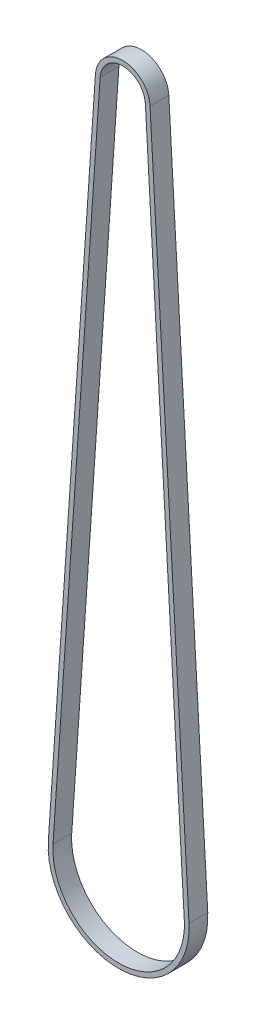
ISO-10303-21;
HEADER;
FILE_DESCRIPTION(('STEP AP214'),'2;1');
FILE_NAME('part.step','',(''),(''),'','','');
FILE_SCHEMA(('AUTOMOTIVE_DESIGN { 1 0 10303 214 1 1 1 1 }'));
ENDSEC;
DATA;
#1=APPLICATION_CONTEXT('core data for automotive mechanical design processes');
#2=APPLICATION_PROTOCOL_DEFINITION('international standard','automotive_design',2000,#1);
#3=PRODUCT_CONTEXT('',#1,'mechanical');
#4=PRODUCT('Part','Part','',(#3));
#5=PRODUCT_RELATED_PRODUCT_CATEGORY('part','',(#4));
#6=PRODUCT_DEFINITION_FORMATION('','',#4);
#7=PRODUCT_DEFINITION_CONTEXT('part definition',#1,'design');
#8=PRODUCT_DEFINITION('design','',#6,#7);
#9=PRODUCT_DEFINITION_SHAPE('','',#8);
#10=(LENGTH_UNIT() NAMED_UNIT(*) SI_UNIT(.MILLI.,.METRE.));
#11=(NAMED_UNIT(*) PLANE_ANGLE_UNIT() SI_UNIT($,.RADIAN.));
#12=(NAMED_UNIT(*) SI_UNIT($,.STERADIAN.) SOLID_ANGLE_UNIT());
#13=UNCERTAINTY_MEASURE_WITH_UNIT(LENGTH_MEASURE(1.E-05),#10,'distance_accuracy_value','');
#14=(GEOMETRIC_REPRESENTATION_CONTEXT(3) GLOBAL_UNCERTAINTY_ASSIGNED_CONTEXT((#13)) GLOBAL_UNIT_ASSIGNED_CONTEXT((#10,
#11,#12)) REPRESENTATION_CONTEXT('',''));
#15=CARTESIAN_POINT('',(0.,0.,0.));
#16=DIRECTION('',(0.,0.,1.));
#17=DIRECTION('',(1.,0.,0.));
#18=AXIS2_PLACEMENT_3D('',#15,#16,#17);
#19=CARTESIAN_POINT('',(-1.3156387901082,-220.93626178578,6.));
#20=DIRECTION('',(0.,0.,-1.));
#21=DIRECTION('',(-1.,0.,0.));
#22=AXIS2_PLACEMENT_3D('',#19,#20,#21);
#23=CYLINDRICAL_SURFACE('',#22,22.55);
#24=CARTESIAN_POINT('',(-1.3156387901082,-220.93626178578,0.));
#25=DIRECTION('',(0.,0.,-1.));
#26=DIRECTION('',(-1.,0.,0.));
#27=AXIS2_PLACEMENT_3D('',#24,#25,#26);
#28=CIRCLE('',#27,22.55);
#29=CARTESIAN_POINT('',(21.1983192253964,-219.661822899017,0.));
#30=VERTEX_POINT('',#29);
#31=CARTESIAN_POINT('',(-23.8128225639669,-219.393789016093,0.));
#32=VERTEX_POINT('',#31);
#33=EDGE_CURVE('E164',#30,#32,#28,.T.);
#34=ORIENTED_EDGE('',*,*,#33,.F.);
#35=DIRECTION('',(0.,0.,-1.));
#36=VECTOR('',#35,1.);
#37=CARTESIAN_POINT('',(21.1983192253964,-219.661822899017,6.));
#38=LINE('',#37,#36);
#39=CARTESIAN_POINT('',(21.1983192253964,-219.661822899017,6.));
#40=VERTEX_POINT('',#39);
#41=EDGE_CURVE('E12',#40,#30,#38,.T.);
#42=ORIENTED_EDGE('',*,*,#41,.F.);
#43=CARTESIAN_POINT('',(-1.3156387901082,-220.93626178578,6.));
#44=DIRECTION('',(0.,0.,-1.));
#45=DIRECTION('',(-1.,0.,0.));
#46=AXIS2_PLACEMENT_3D('',#43,#44,#45);
#47=CIRCLE('',#46,22.55);
#48=CARTESIAN_POINT('',(-23.8128225639669,-219.393789016093,6.));
#49=VERTEX_POINT('',#48);
#50=EDGE_CURVE('E166',#40,#49,#47,.T.);
#51=ORIENTED_EDGE('',*,*,#50,.T.);
#52=DIRECTION('',(0.,0.,-1.));
#53=VECTOR('',#52,1.);
#54=CARTESIAN_POINT('',(-23.8128225639669,-219.393789016093,6.));
#55=LINE('',#54,#53);
#56=EDGE_CURVE('E66',#49,#32,#55,.T.);
#57=ORIENTED_EDGE('',*,*,#56,.T.);
#58=EDGE_LOOP('',(#34,#42,#51,#57));
#59=FACE_BOUND('',#58,.T.);
#60=ADVANCED_FACE('F70',(#59),#23,.T.);
#61=CARTESIAN_POINT('',(21.1983192253964,-219.661822899016,6.));
#62=DIRECTION('',(0.998401685831691,0.0565161368852946,0.));
#63=DIRECTION('',(-0.0565161368852946,0.998401685831691,0.));
#64=AXIS2_PLACEMENT_3D('',#61,#62,#63);
#65=PLANE('',#64);
#66=DIRECTION('',(0.0565161368852946,-0.998401685831691,0.));
#67=VECTOR('',#66,1.);
#68=CARTESIAN_POINT('',(21.1983192253964,-219.661822899016,0.));
#69=LINE('',#68,#67);
#70=CARTESIAN_POINT('',(8.7360147510273,0.494516197746327,0.));
#71=VERTEX_POINT('',#70);
#72=EDGE_CURVE('E171',#71,#30,#69,.T.);
#73=ORIENTED_EDGE('',*,*,#72,.F.);
#74=DIRECTION('',(0.,0.,-1.));
#75=VECTOR('',#74,1.);
#76=CARTESIAN_POINT('',(8.7360147510273,0.494516197746327,6.));
#77=LINE('',#76,#75);
#78=CARTESIAN_POINT('',(8.7360147510273,0.494516197746327,6.));
#79=VERTEX_POINT('',#78);
#80=EDGE_CURVE('E73',#79,#71,#77,.T.);
#81=ORIENTED_EDGE('',*,*,#80,.F.);
#82=DIRECTION('',(0.0565161368852946,-0.998401685831691,0.));
#83=VECTOR('',#82,1.);
#84=CARTESIAN_POINT('',(21.1983192253964,-219.661822899016,6.));
#85=LINE('',#84,#83);
#86=EDGE_CURVE('E179',#79,#40,#85,.T.);
#87=ORIENTED_EDGE('',*,*,#86,.T.);
#88=ORIENTED_EDGE('',*,*,#41,.T.);
#89=EDGE_LOOP('',(#73,#81,#87,#88));
#90=FACE_BOUND('',#89,.T.);
#91=ADVANCED_FACE('F202',(#90),#65,.T.);
#92=CARTESIAN_POINT('',(0.,0.,6.));
#93=DIRECTION('',(0.,0.,-1.));
#94=DIRECTION('',(-1.,0.,0.));
#95=AXIS2_PLACEMENT_3D('',#92,#93,#94);
#96=CYLINDRICAL_SURFACE('',#95,8.75);
#97=CARTESIAN_POINT('',(0.,0.,0.));
#98=DIRECTION('',(0.,0.,-1.));
#99=DIRECTION('',(-1.,0.,0.));
#100=AXIS2_PLACEMENT_3D('',#97,#98,#99);
#101=CIRCLE('',#100,8.75);
#102=CARTESIAN_POINT('',(-8.7295058989474,0.598520476042835,0.));
#103=VERTEX_POINT('',#102);
#104=EDGE_CURVE('E190',#103,#71,#101,.T.);
#105=ORIENTED_EDGE('',*,*,#104,.F.);
#106=DIRECTION('',(0.,0.,-1.));
#107=VECTOR('',#106,1.);
#108=CARTESIAN_POINT('',(-8.7295058989474,0.598520476042835,6.));
#109=LINE('',#108,#107);
#110=CARTESIAN_POINT('',(-8.7295058989474,0.598520476042835,6.));
#111=VERTEX_POINT('',#110);
#112=EDGE_CURVE('E195',#111,#103,#109,.T.);
#113=ORIENTED_EDGE('',*,*,#112,.F.);
#114=CARTESIAN_POINT('',(0.,0.,6.));
#115=DIRECTION('',(0.,0.,-1.));
#116=DIRECTION('',(-1.,0.,0.));
#117=AXIS2_PLACEMENT_3D('',#114,#115,#116);
#118=CIRCLE('',#117,8.75);
#119=EDGE_CURVE('E177',#111,#79,#118,.T.);
#120=ORIENTED_EDGE('',*,*,#119,.T.);
#121=ORIENTED_EDGE('',*,*,#80,.T.);
#122=EDGE_LOOP('',(#105,#113,#120,#121));
#123=FACE_BOUND('',#122,.T.);
#124=ADVANCED_FACE('F207',(#123),#96,.T.);
#125=CARTESIAN_POINT('',(-23.8128225639669,-219.393789016093,6.));
#126=DIRECTION('',(-0.997657817022561,0.0684023401191729,0.));
#127=DIRECTION('',(-0.068402340119173,-0.997657817022561,0.));
#128=AXIS2_PLACEMENT_3D('',#125,#126,#127);
#129=PLANE('',#128);
#130=DIRECTION('',(0.068402340119173,0.997657817022561,0.));
#131=VECTOR('',#130,1.);
#132=CARTESIAN_POINT('',(-23.8128225639669,-219.393789016093,0.));
#133=LINE('',#132,#131);
#134=EDGE_CURVE('E184',#32,#103,#133,.T.);
#135=ORIENTED_EDGE('',*,*,#134,.F.);
#136=ORIENTED_EDGE('',*,*,#56,.F.);
#137=DIRECTION('',(0.068402340119173,0.997657817022561,0.));
#138=VECTOR('',#137,1.);
#139=CARTESIAN_POINT('',(-23.8128225639669,-219.393789016093,6.));
#140=LINE('',#139,#138);
#141=EDGE_CURVE('E175',#49,#111,#140,.T.);
#142=ORIENTED_EDGE('',*,*,#141,.T.);
#143=ORIENTED_EDGE('',*,*,#112,.T.);
#144=EDGE_LOOP('',(#135,#136,#142,#143));
#145=FACE_BOUND('',#144,.T.);
#146=ADVANCED_FACE('F199',(#145),#129,.T.);
#147=CARTESIAN_POINT('',(-1.3156387901082,-220.93626178578,6.));
#148=DIRECTION('',(0.,0.,-1.));
#149=DIRECTION('',(-1.,0.,0.));
#150=AXIS2_PLACEMENT_3D('',#147,#148,#149);
#151=PLANE('',#150);
#152=DIRECTION('',(0.0565161368852946,-0.998401685831691,0.));
#153=VECTOR('',#152,1.);
#154=CARTESIAN_POINT('',(7.23841222227976,0.409741992418386,6.));
#155=LINE('',#154,#153);
#156=CARTESIAN_POINT('',(7.23841222227976,0.409741992418385,6.));
#157=VERTEX_POINT('',#156);
#158=CARTESIAN_POINT('',(19.7007166966489,-219.746597104344,6.));
#159=VERTEX_POINT('',#158);
#160=EDGE_CURVE('E136',#157,#159,#155,.T.);
#161=ORIENTED_EDGE('',*,*,#160,.T.);
#162=CARTESIAN_POINT('',(-1.3156387901082,-220.93626178578,6.));
#163=DIRECTION('',(0.,0.,-1.));
#164=DIRECTION('',(-1.,0.,0.));
#165=AXIS2_PLACEMENT_3D('',#162,#163,#164);
#166=CIRCLE('',#165,21.05);
#167=CARTESIAN_POINT('',(-22.3163358384331,-219.496392526271,6.));
#168=VERTEX_POINT('',#167);
#169=EDGE_CURVE('E132',#159,#168,#166,.T.);
#170=ORIENTED_EDGE('',*,*,#169,.T.);
#171=DIRECTION('',(0.0684023401191729,0.997657817022561,0.));
#172=VECTOR('',#171,1.);
#173=CARTESIAN_POINT('',(-22.3163358384331,-219.496392526271,6.));
#174=LINE('',#173,#172);
#175=CARTESIAN_POINT('',(-7.23301917341356,0.495916965864013,6.));
#176=VERTEX_POINT('',#175);
#177=EDGE_CURVE('E141',#168,#176,#174,.T.);
#178=ORIENTED_EDGE('',*,*,#177,.T.);
#179=CARTESIAN_POINT('',(0.,0.,6.));
#180=DIRECTION('',(0.,0.,-1.));
#181=DIRECTION('',(-1.,0.,0.));
#182=AXIS2_PLACEMENT_3D('',#179,#180,#181);
#183=CIRCLE('',#182,7.25);
#184=EDGE_CURVE('E83',#176,#157,#183,.T.);
#185=ORIENTED_EDGE('',*,*,#184,.T.);
#186=EDGE_LOOP('',(#161,#170,#178,#185));
#187=FACE_BOUND('',#186,.T.);
#188=ORIENTED_EDGE('',*,*,#50,.F.);
#189=ORIENTED_EDGE('',*,*,#86,.F.);
#190=ORIENTED_EDGE('',*,*,#119,.F.);
#191=ORIENTED_EDGE('',*,*,#141,.F.);
#192=EDGE_LOOP('',(#188,#189,#190,#191));
#193=FACE_BOUND('',#192,.T.);
#194=ADVANCED_FACE('F150',(#187,#193),#151,.F.);
#195=CARTESIAN_POINT('',(-1.3156387901082,-220.93626178578,0.));
#196=DIRECTION('',(0.,0.,-1.));
#197=DIRECTION('',(-1.,0.,0.));
#198=AXIS2_PLACEMENT_3D('',#195,#196,#197);
#199=PLANE('',#198);
#200=CARTESIAN_POINT('',(-1.3156387901082,-220.93626178578,0.));
#201=DIRECTION('',(0.,0.,-1.));
#202=DIRECTION('',(-1.,0.,0.));
#203=AXIS2_PLACEMENT_3D('',#200,#201,#202);
#204=CIRCLE('',#203,21.05);
#205=CARTESIAN_POINT('',(19.7007166966489,-219.746597104344,0.));
#206=VERTEX_POINT('',#205);
#207=CARTESIAN_POINT('',(-22.3163358384331,-219.496392526271,0.));
#208=VERTEX_POINT('',#207);
#209=EDGE_CURVE('E93',#206,#208,#204,.T.);
#210=ORIENTED_EDGE('',*,*,#209,.F.);
#211=DIRECTION('',(0.0565161368852946,-0.998401685831691,0.));
#212=VECTOR('',#211,1.);
#213=CARTESIAN_POINT('',(7.23841222227976,0.409741992418386,0.));
#214=LINE('',#213,#212);
#215=CARTESIAN_POINT('',(7.23841222227976,0.409741992418385,0.));
#216=VERTEX_POINT('',#215);
#217=EDGE_CURVE('E147',#216,#206,#214,.T.);
#218=ORIENTED_EDGE('',*,*,#217,.F.);
#219=CARTESIAN_POINT('',(0.,0.,0.));
#220=DIRECTION('',(0.,0.,-1.));
#221=DIRECTION('',(-1.,0.,0.));
#222=AXIS2_PLACEMENT_3D('',#219,#220,#221);
#223=CIRCLE('',#222,7.25);
#224=CARTESIAN_POINT('',(-7.23301917341356,0.495916965864004,0.));
#225=VERTEX_POINT('',#224);
#226=EDGE_CURVE('E153',#225,#216,#223,.T.);
#227=ORIENTED_EDGE('',*,*,#226,.F.);
#228=DIRECTION('',(0.0684023401191729,0.997657817022561,0.));
#229=VECTOR('',#228,1.);
#230=CARTESIAN_POINT('',(-22.3163358384331,-219.496392526271,0.));
#231=LINE('',#230,#229);
#232=EDGE_CURVE('E157',#208,#225,#231,.T.);
#233=ORIENTED_EDGE('',*,*,#232,.F.);
#234=EDGE_LOOP('',(#210,#218,#227,#233));
#235=FACE_BOUND('',#234,.T.);
#236=ORIENTED_EDGE('',*,*,#33,.T.);
#237=ORIENTED_EDGE('',*,*,#134,.T.);
#238=ORIENTED_EDGE('',*,*,#104,.T.);
#239=ORIENTED_EDGE('',*,*,#72,.T.);
#240=EDGE_LOOP('',(#236,#237,#238,#239));
#241=FACE_BOUND('',#240,.T.);
#242=ADVANCED_FACE('F205',(#235,#241),#199,.T.);
#243=CARTESIAN_POINT('',(-1.3156387901082,-220.93626178578,6.));
#244=DIRECTION('',(0.,0.,-1.));
#245=DIRECTION('',(-1.,0.,0.));
#246=AXIS2_PLACEMENT_3D('',#243,#244,#245);
#247=CYLINDRICAL_SURFACE('',#246,21.05);
#248=ORIENTED_EDGE('',*,*,#209,.T.);
#249=DIRECTION('',(0.,0.,-1.));
#250=VECTOR('',#249,1.);
#251=CARTESIAN_POINT('',(-22.3163358384331,-219.496392526271,6.));
#252=LINE('',#251,#250);
#253=EDGE_CURVE('E128',#168,#208,#252,.T.);
#254=ORIENTED_EDGE('',*,*,#253,.F.);
#255=ORIENTED_EDGE('',*,*,#169,.F.);
#256=DIRECTION('',(0.,0.,-1.));
#257=VECTOR('',#256,1.);
#258=CARTESIAN_POINT('',(19.7007166966489,-219.746597104344,6.));
#259=LINE('',#258,#257);
#260=EDGE_CURVE('E162',#159,#206,#259,.T.);
#261=ORIENTED_EDGE('',*,*,#260,.T.);
#262=EDGE_LOOP('',(#248,#254,#255,#261));
#263=FACE_BOUND('',#262,.T.);
#264=ADVANCED_FACE('F135',(#263),#247,.F.);
#265=CARTESIAN_POINT('',(7.23841222227976,0.409741992418386,6.));
#266=DIRECTION('',(0.998401685831691,0.0565161368852946,0.));
#267=DIRECTION('',(-0.0565161368852946,0.998401685831691,0.));
#268=AXIS2_PLACEMENT_3D('',#265,#266,#267);
#269=PLANE('',#268);
#270=ORIENTED_EDGE('',*,*,#217,.T.);
#271=ORIENTED_EDGE('',*,*,#260,.F.);
#272=ORIENTED_EDGE('',*,*,#160,.F.);
#273=DIRECTION('',(0.,0.,-1.));
#274=VECTOR('',#273,1.);
#275=CARTESIAN_POINT('',(7.23841222227976,0.409741992418385,6.));
#276=LINE('',#275,#274);
#277=EDGE_CURVE('E167',#157,#216,#276,.T.);
#278=ORIENTED_EDGE('',*,*,#277,.T.);
#279=EDGE_LOOP('',(#270,#271,#272,#278));
#280=FACE_BOUND('',#279,.T.);
#281=ADVANCED_FACE('F265',(#280),#269,.F.);
#282=CARTESIAN_POINT('',(0.,0.,6.));
#283=DIRECTION('',(0.,0.,-1.));
#284=DIRECTION('',(-1.,0.,0.));
#285=AXIS2_PLACEMENT_3D('',#282,#283,#284);
#286=CYLINDRICAL_SURFACE('',#285,7.25);
#287=ORIENTED_EDGE('',*,*,#226,.T.);
#288=ORIENTED_EDGE('',*,*,#277,.F.);
#289=ORIENTED_EDGE('',*,*,#184,.F.);
#290=DIRECTION('',(0.,0.,-1.));
#291=VECTOR('',#290,1.);
#292=CARTESIAN_POINT('',(-7.23301917341356,0.495916965864004,6.));
#293=LINE('',#292,#291);
#294=EDGE_CURVE('E139',#176,#225,#293,.T.);
#295=ORIENTED_EDGE('',*,*,#294,.T.);
#296=EDGE_LOOP('',(#287,#288,#289,#295));
#297=FACE_BOUND('',#296,.T.);
#298=ADVANCED_FACE('F271',(#297),#286,.F.);
#299=CARTESIAN_POINT('',(-22.3163358384331,-219.496392526271,6.));
#300=DIRECTION('',(-0.997657817022561,0.0684023401191729,0.));
#301=DIRECTION('',(-0.068402340119173,-0.997657817022561,0.));
#302=AXIS2_PLACEMENT_3D('',#299,#300,#301);
#303=PLANE('',#302);
#304=ORIENTED_EDGE('',*,*,#232,.T.);
#305=ORIENTED_EDGE('',*,*,#294,.F.);
#306=ORIENTED_EDGE('',*,*,#177,.F.);
#307=ORIENTED_EDGE('',*,*,#253,.T.);
#308=EDGE_LOOP('',(#304,#305,#306,#307));
#309=FACE_BOUND('',#308,.T.);
#310=ADVANCED_FACE('F145',(#309),#303,.F.);
#311=CLOSED_SHELL('',(#60,#91,#124,#146,#194,#242,#264,#281,#298,#310));
#312=MANIFOLD_SOLID_BREP('B2',#311);
#313=ADVANCED_BREP_SHAPE_REPRESENTATION('',(#18,#312),#14);
#314=SHAPE_DEFINITION_REPRESENTATION(#9,#313);
ENDSEC;
END-ISO-10303-21;
